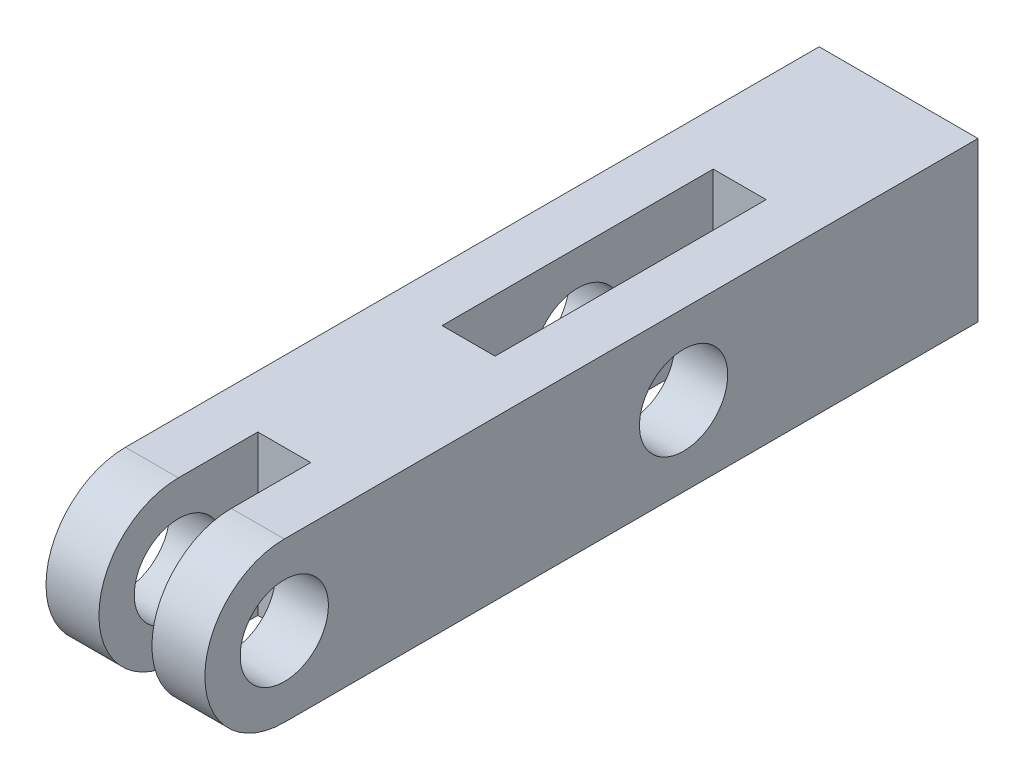
ISO-10303-21;
HEADER;
FILE_DESCRIPTION(('STEP AP214'),'2;1');
FILE_NAME('part.step','',(''),(''),'','','');
FILE_SCHEMA(('AUTOMOTIVE_DESIGN { 1 0 10303 214 1 1 1 1 }'));
ENDSEC;
DATA;
#1=APPLICATION_CONTEXT('core data for automotive mechanical design processes');
#2=APPLICATION_PROTOCOL_DEFINITION('international standard','automotive_design',2000,#1);
#3=PRODUCT_CONTEXT('',#1,'mechanical');
#4=PRODUCT('Part','Part','',(#3));
#5=PRODUCT_RELATED_PRODUCT_CATEGORY('part','',(#4));
#6=PRODUCT_DEFINITION_FORMATION('','',#4);
#7=PRODUCT_DEFINITION_CONTEXT('part definition',#1,'design');
#8=PRODUCT_DEFINITION('design','',#6,#7);
#9=PRODUCT_DEFINITION_SHAPE('','',#8);
#10=(LENGTH_UNIT() NAMED_UNIT(*) SI_UNIT(.MILLI.,.METRE.));
#11=(NAMED_UNIT(*) PLANE_ANGLE_UNIT() SI_UNIT($,.RADIAN.));
#12=(NAMED_UNIT(*) SI_UNIT($,.STERADIAN.) SOLID_ANGLE_UNIT());
#13=UNCERTAINTY_MEASURE_WITH_UNIT(LENGTH_MEASURE(1.E-05),#10,'distance_accuracy_value','');
#14=(GEOMETRIC_REPRESENTATION_CONTEXT(3) GLOBAL_UNCERTAINTY_ASSIGNED_CONTEXT((#13)) GLOBAL_UNIT_ASSIGNED_CONTEXT((#10,
#11,#12)) REPRESENTATION_CONTEXT('',''));
#15=CARTESIAN_POINT('',(0.,0.,0.));
#16=DIRECTION('',(0.,0.,1.));
#17=DIRECTION('',(1.,0.,0.));
#18=AXIS2_PLACEMENT_3D('',#15,#16,#17);
#19=CARTESIAN_POINT('',(3.,0.,9.));
#20=DIRECTION('',(1.,0.,0.));
#21=DIRECTION('',(0.,1.,0.));
#22=AXIS2_PLACEMENT_3D('',#19,#20,#21);
#23=PLANE('',#22);
#24=CARTESIAN_POINT('',(3.,4.5,4.5));
#25=DIRECTION('',(1.,0.,0.));
#26=DIRECTION('',(0.,1.,0.));
#27=AXIS2_PLACEMENT_3D('',#24,#25,#26);
#28=CIRCLE('',#27,2.5);
#29=CARTESIAN_POINT('',(3.,7.,4.5));
#30=VERTEX_POINT('',#29);
#31=EDGE_CURVE('E292',#30,#30,#28,.T.);
#32=ORIENTED_EDGE('',*,*,#31,.F.);
#33=EDGE_LOOP('',(#32));
#34=FACE_BOUND('',#33,.T.);
#35=CARTESIAN_POINT('',(3.,4.5,4.5));
#36=DIRECTION('',(1.,0.,0.));
#37=DIRECTION('',(0.,1.,0.));
#38=AXIS2_PLACEMENT_3D('',#35,#36,#37);
#39=CIRCLE('',#38,4.5);
#40=CARTESIAN_POINT('',(3.,9.,4.5));
#41=VERTEX_POINT('',#40);
#42=CARTESIAN_POINT('',(3.,0.,4.5));
#43=VERTEX_POINT('',#42);
#44=EDGE_CURVE('E208',#41,#43,#39,.T.);
#45=ORIENTED_EDGE('',*,*,#44,.T.);
#46=DIRECTION('',(0.,0.,-1.));
#47=VECTOR('',#46,1.);
#48=CARTESIAN_POINT('',(3.,0.,9.));
#49=LINE('',#48,#47);
#50=CARTESIAN_POINT('',(3.,0.,0.));
#51=VERTEX_POINT('',#50);
#52=EDGE_CURVE('E181',#43,#51,#49,.T.);
#53=ORIENTED_EDGE('',*,*,#52,.T.);
#54=DIRECTION('',(0.,-1.,0.));
#55=VECTOR('',#54,1.);
#56=CARTESIAN_POINT('',(3.,0.,0.));
#57=LINE('',#56,#55);
#58=CARTESIAN_POINT('',(3.,9.,0.));
#59=VERTEX_POINT('',#58);
#60=EDGE_CURVE('E190',#59,#51,#57,.T.);
#61=ORIENTED_EDGE('',*,*,#60,.F.);
#62=DIRECTION('',(0.,0.,-1.));
#63=VECTOR('',#62,1.);
#64=CARTESIAN_POINT('',(3.,9.,9.));
#65=LINE('',#64,#63);
#66=EDGE_CURVE('E12',#41,#59,#65,.T.);
#67=ORIENTED_EDGE('',*,*,#66,.F.);
#68=EDGE_LOOP('',(#45,#53,#61,#67));
#69=FACE_BOUND('',#68,.T.);
#70=ADVANCED_FACE('F75',(#34,#69),#23,.T.);
#71=CARTESIAN_POINT('',(0.,0.,9.));
#72=DIRECTION('',(-1.,0.,0.));
#73=DIRECTION('',(0.,-1.,0.));
#74=AXIS2_PLACEMENT_3D('',#71,#72,#73);
#75=PLANE('',#74);
#76=CARTESIAN_POINT('',(0.,4.5,4.5));
#77=DIRECTION('',(1.,0.,0.));
#78=DIRECTION('',(0.,0.,-1.));
#79=AXIS2_PLACEMENT_3D('',#76,#77,#78);
#80=CIRCLE('',#79,2.5);
#81=CARTESIAN_POINT('',(0.,4.5,2.));
#82=VERTEX_POINT('',#81);
#83=EDGE_CURVE('E299',#82,#82,#80,.T.);
#84=ORIENTED_EDGE('',*,*,#83,.T.);
#85=EDGE_LOOP('',(#84));
#86=FACE_BOUND('',#85,.T.);
#87=CARTESIAN_POINT('',(0.,4.5,-18.12));
#88=DIRECTION('',(1.,0.,0.));
#89=DIRECTION('',(0.,0.,-1.));
#90=AXIS2_PLACEMENT_3D('',#87,#88,#89);
#91=CIRCLE('',#90,2.5);
#92=CARTESIAN_POINT('',(0.,4.5,-20.62));
#93=VERTEX_POINT('',#92);
#94=EDGE_CURVE('E196',#93,#93,#91,.T.);
#95=ORIENTED_EDGE('',*,*,#94,.T.);
#96=EDGE_LOOP('',(#95));
#97=FACE_BOUND('',#96,.T.);
#98=DIRECTION('',(0.,0.,-1.));
#99=VECTOR('',#98,1.);
#100=CARTESIAN_POINT('',(0.,0.,9.));
#101=LINE('',#100,#99);
#102=CARTESIAN_POINT('',(0.,0.,4.5));
#103=VERTEX_POINT('',#102);
#104=CARTESIAN_POINT('',(0.,0.,-34.8));
#105=VERTEX_POINT('',#104);
#106=EDGE_CURVE('E178',#103,#105,#101,.T.);
#107=ORIENTED_EDGE('',*,*,#106,.F.);
#108=CARTESIAN_POINT('',(0.,4.5,4.5));
#109=DIRECTION('',(1.,0.,0.));
#110=DIRECTION('',(0.,0.,-1.));
#111=AXIS2_PLACEMENT_3D('',#108,#109,#110);
#112=CIRCLE('',#111,4.5);
#113=CARTESIAN_POINT('',(0.,9.,4.5));
#114=VERTEX_POINT('',#113);
#115=EDGE_CURVE('E162',#114,#103,#112,.T.);
#116=ORIENTED_EDGE('',*,*,#115,.F.);
#117=DIRECTION('',(0.,0.,-1.));
#118=VECTOR('',#117,1.);
#119=CARTESIAN_POINT('',(0.,9.,9.));
#120=LINE('',#119,#118);
#121=CARTESIAN_POINT('',(0.,9.,-34.8));
#122=VERTEX_POINT('',#121);
#123=EDGE_CURVE('E83',#114,#122,#120,.T.);
#124=ORIENTED_EDGE('',*,*,#123,.T.);
#125=DIRECTION('',(0.,1.,0.));
#126=VECTOR('',#125,1.);
#127=CARTESIAN_POINT('',(0.,9.,-34.8));
#128=LINE('',#127,#126);
#129=EDGE_CURVE('E187',#105,#122,#128,.T.);
#130=ORIENTED_EDGE('',*,*,#129,.F.);
#131=EDGE_LOOP('',(#107,#116,#124,#130));
#132=FACE_BOUND('',#131,.T.);
#133=ADVANCED_FACE('F185',(#86,#97,#132),#75,.T.);
#134=CARTESIAN_POINT('',(9.,9.,-10.44));
#135=DIRECTION('',(-1.,0.,0.));
#136=DIRECTION('',(0.,0.,1.));
#137=AXIS2_PLACEMENT_3D('',#134,#135,#136);
#138=PLANE('',#137);
#139=CARTESIAN_POINT('',(9.,4.5,4.5));
#140=DIRECTION('',(1.,0.,0.));
#141=DIRECTION('',(0.,0.,-1.));
#142=AXIS2_PLACEMENT_3D('',#139,#140,#141);
#143=CIRCLE('',#142,2.5);
#144=CARTESIAN_POINT('',(9.,4.5,2.));
#145=VERTEX_POINT('',#144);
#146=EDGE_CURVE('E296',#145,#145,#143,.T.);
#147=ORIENTED_EDGE('',*,*,#146,.F.);
#148=EDGE_LOOP('',(#147));
#149=FACE_BOUND('',#148,.T.);
#150=CARTESIAN_POINT('',(9.,4.5,-18.12));
#151=DIRECTION('',(1.,0.,0.));
#152=DIRECTION('',(0.,0.,-1.));
#153=AXIS2_PLACEMENT_3D('',#150,#151,#152);
#154=CIRCLE('',#153,2.5);
#155=CARTESIAN_POINT('',(9.,4.5,-20.62));
#156=VERTEX_POINT('',#155);
#157=EDGE_CURVE('E203',#156,#156,#154,.T.);
#158=ORIENTED_EDGE('',*,*,#157,.F.);
#159=EDGE_LOOP('',(#158));
#160=FACE_BOUND('',#159,.T.);
#161=CARTESIAN_POINT('',(9.,4.5,4.5));
#162=DIRECTION('',(1.,0.,0.));
#163=DIRECTION('',(0.,0.,-1.));
#164=AXIS2_PLACEMENT_3D('',#161,#162,#163);
#165=CIRCLE('',#164,4.5);
#166=CARTESIAN_POINT('',(9.,9.,4.5));
#167=VERTEX_POINT('',#166);
#168=CARTESIAN_POINT('',(9.,0.,4.5));
#169=VERTEX_POINT('',#168);
#170=EDGE_CURVE('E173',#167,#169,#165,.T.);
#171=ORIENTED_EDGE('',*,*,#170,.T.);
#172=DIRECTION('',(0.,0.,1.));
#173=VECTOR('',#172,1.);
#174=CARTESIAN_POINT('',(9.,0.,-10.44));
#175=LINE('',#174,#173);
#176=CARTESIAN_POINT('',(9.,0.,-34.8));
#177=VERTEX_POINT('',#176);
#178=EDGE_CURVE('E261',#177,#169,#175,.T.);
#179=ORIENTED_EDGE('',*,*,#178,.F.);
#180=DIRECTION('',(0.,-1.,0.));
#181=VECTOR('',#180,1.);
#182=CARTESIAN_POINT('',(9.,9.,-34.8));
#183=LINE('',#182,#181);
#184=CARTESIAN_POINT('',(9.,9.,-34.8));
#185=VERTEX_POINT('',#184);
#186=EDGE_CURVE('E213',#185,#177,#183,.T.);
#187=ORIENTED_EDGE('',*,*,#186,.F.);
#188=DIRECTION('',(0.,0.,1.));
#189=VECTOR('',#188,1.);
#190=CARTESIAN_POINT('',(9.,9.,-10.44));
#191=LINE('',#190,#189);
#192=EDGE_CURVE('E267',#185,#167,#191,.T.);
#193=ORIENTED_EDGE('',*,*,#192,.T.);
#194=EDGE_LOOP('',(#171,#179,#187,#193));
#195=FACE_BOUND('',#194,.T.);
#196=ADVANCED_FACE('F307',(#149,#160,#195),#138,.F.);
#197=CARTESIAN_POINT('',(6.,0.,9.));
#198=DIRECTION('',(1.,0.,0.));
#199=DIRECTION('',(0.,1.,0.));
#200=AXIS2_PLACEMENT_3D('',#197,#198,#199);
#201=PLANE('',#200);
#202=CARTESIAN_POINT('',(6.,4.5,4.5));
#203=DIRECTION('',(1.,0.,0.));
#204=DIRECTION('',(0.,1.,0.));
#205=AXIS2_PLACEMENT_3D('',#202,#203,#204);
#206=CIRCLE('',#205,2.5);
#207=CARTESIAN_POINT('',(6.,7.,4.5));
#208=VERTEX_POINT('',#207);
#209=EDGE_CURVE('E78',#208,#208,#206,.T.);
#210=ORIENTED_EDGE('',*,*,#209,.T.);
#211=EDGE_LOOP('',(#210));
#212=FACE_BOUND('',#211,.T.);
#213=DIRECTION('',(0.,0.,-1.));
#214=VECTOR('',#213,1.);
#215=CARTESIAN_POINT('',(6.,0.,9.));
#216=LINE('',#215,#214);
#217=CARTESIAN_POINT('',(6.,0.,4.5));
#218=VERTEX_POINT('',#217);
#219=CARTESIAN_POINT('',(6.,0.,0.));
#220=VERTEX_POINT('',#219);
#221=EDGE_CURVE('E252',#218,#220,#216,.T.);
#222=ORIENTED_EDGE('',*,*,#221,.F.);
#223=CARTESIAN_POINT('',(6.,4.5,4.5));
#224=DIRECTION('',(1.,0.,0.));
#225=DIRECTION('',(0.,1.,0.));
#226=AXIS2_PLACEMENT_3D('',#223,#224,#225);
#227=CIRCLE('',#226,4.5);
#228=CARTESIAN_POINT('',(6.,9.,4.5));
#229=VERTEX_POINT('',#228);
#230=EDGE_CURVE('E289',#229,#218,#227,.T.);
#231=ORIENTED_EDGE('',*,*,#230,.F.);
#232=DIRECTION('',(0.,0.,-1.));
#233=VECTOR('',#232,1.);
#234=CARTESIAN_POINT('',(6.,9.,9.));
#235=LINE('',#234,#233);
#236=CARTESIAN_POINT('',(6.,9.,0.));
#237=VERTEX_POINT('',#236);
#238=EDGE_CURVE('E254',#229,#237,#235,.T.);
#239=ORIENTED_EDGE('',*,*,#238,.T.);
#240=DIRECTION('',(0.,-1.,0.));
#241=VECTOR('',#240,1.);
#242=CARTESIAN_POINT('',(6.,0.,0.));
#243=LINE('',#242,#241);
#244=EDGE_CURVE('E249',#237,#220,#243,.T.);
#245=ORIENTED_EDGE('',*,*,#244,.T.);
#246=EDGE_LOOP('',(#222,#231,#239,#245));
#247=FACE_BOUND('',#246,.T.);
#248=ADVANCED_FACE('F283',(#212,#247),#201,.F.);
#249=CARTESIAN_POINT('',(0.,0.,9.));
#250=DIRECTION('',(0.,1.,0.));
#251=DIRECTION('',(0.,0.,1.));
#252=AXIS2_PLACEMENT_3D('',#249,#250,#251);
#253=PLANE('',#252);
#254=DIRECTION('',(0.,0.,1.));
#255=VECTOR('',#254,1.);
#256=CARTESIAN_POINT('',(6.,0.,-25.8));
#257=LINE('',#256,#255);
#258=CARTESIAN_POINT('',(6.,0.,-25.8));
#259=VERTEX_POINT('',#258);
#260=CARTESIAN_POINT('',(6.,0.,-10.44));
#261=VERTEX_POINT('',#260);
#262=EDGE_CURVE('E246',#259,#261,#257,.T.);
#263=ORIENTED_EDGE('',*,*,#262,.F.);
#264=DIRECTION('',(-1.,0.,0.));
#265=VECTOR('',#264,1.);
#266=CARTESIAN_POINT('',(9.,0.,-25.8));
#267=LINE('',#266,#265);
#268=CARTESIAN_POINT('',(3.,0.,-25.8));
#269=VERTEX_POINT('',#268);
#270=EDGE_CURVE('E200',#259,#269,#267,.T.);
#271=ORIENTED_EDGE('',*,*,#270,.T.);
#272=DIRECTION('',(0.,0.,1.));
#273=VECTOR('',#272,1.);
#274=CARTESIAN_POINT('',(3.,0.,-25.8));
#275=LINE('',#274,#273);
#276=CARTESIAN_POINT('',(3.,0.,-10.44));
#277=VERTEX_POINT('',#276);
#278=EDGE_CURVE('E230',#269,#277,#275,.T.);
#279=ORIENTED_EDGE('',*,*,#278,.T.);
#280=DIRECTION('',(-1.,0.,0.));
#281=VECTOR('',#280,1.);
#282=CARTESIAN_POINT('',(0.,0.,-10.44));
#283=LINE('',#282,#281);
#284=EDGE_CURVE('E96',#261,#277,#283,.T.);
#285=ORIENTED_EDGE('',*,*,#284,.F.);
#286=EDGE_LOOP('',(#263,#271,#279,#285));
#287=FACE_BOUND('',#286,.T.);
#288=DIRECTION('',(1.,0.,0.));
#289=VECTOR('',#288,1.);
#290=CARTESIAN_POINT('',(0.,0.,4.5));
#291=LINE('',#290,#289);
#292=EDGE_CURVE('E165',#103,#43,#291,.T.);
#293=ORIENTED_EDGE('',*,*,#292,.F.);
#294=ORIENTED_EDGE('',*,*,#106,.T.);
#295=DIRECTION('',(-1.,0.,0.));
#296=VECTOR('',#295,1.);
#297=CARTESIAN_POINT('',(9.,0.,-34.8));
#298=LINE('',#297,#296);
#299=EDGE_CURVE('E216',#177,#105,#298,.T.);
#300=ORIENTED_EDGE('',*,*,#299,.F.);
#301=ORIENTED_EDGE('',*,*,#178,.T.);
#302=EDGE_CURVE('E182',#218,#169,#291,.T.);
#303=ORIENTED_EDGE('',*,*,#302,.F.);
#304=ORIENTED_EDGE('',*,*,#221,.T.);
#305=DIRECTION('',(-1.,0.,0.));
#306=VECTOR('',#305,1.);
#307=CARTESIAN_POINT('',(0.,0.,0.));
#308=LINE('',#307,#306);
#309=EDGE_CURVE('E259',#220,#51,#308,.T.);
#310=ORIENTED_EDGE('',*,*,#309,.T.);
#311=ORIENTED_EDGE('',*,*,#52,.F.);
#312=EDGE_LOOP('',(#293,#294,#300,#301,#303,#304,#310,#311));
#313=FACE_BOUND('',#312,.T.);
#314=ADVANCED_FACE('F176',(#287,#313),#253,.F.);
#315=CARTESIAN_POINT('',(0.,9.,9.));
#316=DIRECTION('',(0.,1.,0.));
#317=DIRECTION('',(0.,0.,1.));
#318=AXIS2_PLACEMENT_3D('',#315,#316,#317);
#319=PLANE('',#318);
#320=DIRECTION('',(1.,0.,0.));
#321=VECTOR('',#320,1.);
#322=CARTESIAN_POINT('',(9.,9.,-25.8));
#323=LINE('',#322,#321);
#324=CARTESIAN_POINT('',(3.,9.,-25.8));
#325=VERTEX_POINT('',#324);
#326=CARTESIAN_POINT('',(6.,9.,-25.8));
#327=VERTEX_POINT('',#326);
#328=EDGE_CURVE('E217',#325,#327,#323,.T.);
#329=ORIENTED_EDGE('',*,*,#328,.T.);
#330=DIRECTION('',(0.,0.,1.));
#331=VECTOR('',#330,1.);
#332=CARTESIAN_POINT('',(6.,9.,-25.8));
#333=LINE('',#332,#331);
#334=CARTESIAN_POINT('',(6.,9.,-10.44));
#335=VERTEX_POINT('',#334);
#336=EDGE_CURVE('E241',#327,#335,#333,.T.);
#337=ORIENTED_EDGE('',*,*,#336,.T.);
#338=DIRECTION('',(1.,0.,0.));
#339=VECTOR('',#338,1.);
#340=CARTESIAN_POINT('',(0.,9.,-10.44));
#341=LINE('',#340,#339);
#342=CARTESIAN_POINT('',(3.,9.,-10.44));
#343=VERTEX_POINT('',#342);
#344=EDGE_CURVE('E257',#343,#335,#341,.T.);
#345=ORIENTED_EDGE('',*,*,#344,.F.);
#346=DIRECTION('',(0.,0.,1.));
#347=VECTOR('',#346,1.);
#348=CARTESIAN_POINT('',(3.,9.,-25.8));
#349=LINE('',#348,#347);
#350=EDGE_CURVE('E234',#325,#343,#349,.T.);
#351=ORIENTED_EDGE('',*,*,#350,.F.);
#352=EDGE_LOOP('',(#329,#337,#345,#351));
#353=FACE_BOUND('',#352,.T.);
#354=ORIENTED_EDGE('',*,*,#123,.F.);
#355=DIRECTION('',(1.,0.,0.));
#356=VECTOR('',#355,1.);
#357=CARTESIAN_POINT('',(0.,9.,4.5));
#358=LINE('',#357,#356);
#359=EDGE_CURVE('E168',#114,#41,#358,.T.);
#360=ORIENTED_EDGE('',*,*,#359,.T.);
#361=ORIENTED_EDGE('',*,*,#66,.T.);
#362=DIRECTION('',(1.,0.,0.));
#363=VECTOR('',#362,1.);
#364=CARTESIAN_POINT('',(0.,9.,0.));
#365=LINE('',#364,#363);
#366=EDGE_CURVE('E256',#59,#237,#365,.T.);
#367=ORIENTED_EDGE('',*,*,#366,.T.);
#368=ORIENTED_EDGE('',*,*,#238,.F.);
#369=EDGE_CURVE('E172',#229,#167,#358,.T.);
#370=ORIENTED_EDGE('',*,*,#369,.T.);
#371=ORIENTED_EDGE('',*,*,#192,.F.);
#372=DIRECTION('',(1.,0.,0.));
#373=VECTOR('',#372,1.);
#374=CARTESIAN_POINT('',(9.,9.,-34.8));
#375=LINE('',#374,#373);
#376=EDGE_CURVE('E220',#122,#185,#375,.T.);
#377=ORIENTED_EDGE('',*,*,#376,.F.);
#378=EDGE_LOOP('',(#354,#360,#361,#367,#368,#370,#371,#377));
#379=FACE_BOUND('',#378,.T.);
#380=ADVANCED_FACE('F286',(#353,#379),#319,.T.);
#381=CARTESIAN_POINT('',(0.,0.,-10.44));
#382=DIRECTION('',(0.,0.,1.));
#383=DIRECTION('',(1.,0.,0.));
#384=AXIS2_PLACEMENT_3D('',#381,#382,#383);
#385=PLANE('',#384);
#386=DIRECTION('',(0.,-1.,0.));
#387=VECTOR('',#386,1.);
#388=CARTESIAN_POINT('',(3.,9.,-10.44));
#389=LINE('',#388,#387);
#390=EDGE_CURVE('E91',#343,#277,#389,.T.);
#391=ORIENTED_EDGE('',*,*,#390,.F.);
#392=ORIENTED_EDGE('',*,*,#344,.T.);
#393=DIRECTION('',(0.,1.,0.));
#394=VECTOR('',#393,1.);
#395=CARTESIAN_POINT('',(6.,9.,-10.44));
#396=LINE('',#395,#394);
#397=EDGE_CURVE('E237',#261,#335,#396,.T.);
#398=ORIENTED_EDGE('',*,*,#397,.F.);
#399=ORIENTED_EDGE('',*,*,#284,.T.);
#400=EDGE_LOOP('',(#391,#392,#398,#399));
#401=FACE_BOUND('',#400,.T.);
#402=ADVANCED_FACE('F371',(#401),#385,.F.);
#403=CARTESIAN_POINT('',(0.,0.,0.));
#404=DIRECTION('',(0.,0.,1.));
#405=DIRECTION('',(1.,0.,0.));
#406=AXIS2_PLACEMENT_3D('',#403,#404,#405);
#407=PLANE('',#406);
#408=ORIENTED_EDGE('',*,*,#309,.F.);
#409=ORIENTED_EDGE('',*,*,#244,.F.);
#410=ORIENTED_EDGE('',*,*,#366,.F.);
#411=ORIENTED_EDGE('',*,*,#60,.T.);
#412=EDGE_LOOP('',(#408,#409,#410,#411));
#413=FACE_BOUND('',#412,.T.);
#414=ADVANCED_FACE('F274',(#413),#407,.T.);
#415=CARTESIAN_POINT('',(6.,9.,-25.8));
#416=DIRECTION('',(1.,0.,0.));
#417=DIRECTION('',(0.,1.,0.));
#418=AXIS2_PLACEMENT_3D('',#415,#416,#417);
#419=PLANE('',#418);
#420=CARTESIAN_POINT('',(6.,4.5,-18.12));
#421=DIRECTION('',(1.,0.,0.));
#422=DIRECTION('',(0.,1.,0.));
#423=AXIS2_PLACEMENT_3D('',#420,#421,#422);
#424=CIRCLE('',#423,2.5);
#425=CARTESIAN_POINT('',(6.,7.,-18.12));
#426=VERTEX_POINT('',#425);
#427=EDGE_CURVE('E195',#426,#426,#424,.T.);
#428=ORIENTED_EDGE('',*,*,#427,.T.);
#429=EDGE_LOOP('',(#428));
#430=FACE_BOUND('',#429,.T.);
#431=ORIENTED_EDGE('',*,*,#397,.T.);
#432=ORIENTED_EDGE('',*,*,#336,.F.);
#433=DIRECTION('',(0.,1.,0.));
#434=VECTOR('',#433,1.);
#435=CARTESIAN_POINT('',(6.,9.,-25.8));
#436=LINE('',#435,#434);
#437=EDGE_CURVE('E238',#259,#327,#436,.T.);
#438=ORIENTED_EDGE('',*,*,#437,.F.);
#439=ORIENTED_EDGE('',*,*,#262,.T.);
#440=EDGE_LOOP('',(#431,#432,#438,#439));
#441=FACE_BOUND('',#440,.T.);
#442=ADVANCED_FACE('F352',(#430,#441),#419,.F.);
#443=CARTESIAN_POINT('',(3.,9.,-25.8));
#444=DIRECTION('',(-1.,0.,0.));
#445=DIRECTION('',(0.,-1.,0.));
#446=AXIS2_PLACEMENT_3D('',#443,#444,#445);
#447=PLANE('',#446);
#448=CARTESIAN_POINT('',(3.,4.5,-18.12));
#449=DIRECTION('',(-1.,0.,0.));
#450=DIRECTION('',(0.,-1.,0.));
#451=AXIS2_PLACEMENT_3D('',#448,#449,#450);
#452=CIRCLE('',#451,2.5);
#453=CARTESIAN_POINT('',(3.,2.,-18.12));
#454=VERTEX_POINT('',#453);
#455=EDGE_CURVE('E193',#454,#454,#452,.T.);
#456=ORIENTED_EDGE('',*,*,#455,.T.);
#457=EDGE_LOOP('',(#456));
#458=FACE_BOUND('',#457,.T.);
#459=ORIENTED_EDGE('',*,*,#390,.T.);
#460=ORIENTED_EDGE('',*,*,#278,.F.);
#461=DIRECTION('',(0.,-1.,0.));
#462=VECTOR('',#461,1.);
#463=CARTESIAN_POINT('',(3.,9.,-25.8));
#464=LINE('',#463,#462);
#465=EDGE_CURVE('E227',#325,#269,#464,.T.);
#466=ORIENTED_EDGE('',*,*,#465,.F.);
#467=ORIENTED_EDGE('',*,*,#350,.T.);
#468=EDGE_LOOP('',(#459,#460,#466,#467));
#469=FACE_BOUND('',#468,.T.);
#470=ADVANCED_FACE('F321',(#458,#469),#447,.F.);
#471=CARTESIAN_POINT('',(0.,0.,-25.8));
#472=DIRECTION('',(0.,0.,-1.));
#473=DIRECTION('',(-1.,0.,0.));
#474=AXIS2_PLACEMENT_3D('',#471,#472,#473);
#475=PLANE('',#474);
#476=ORIENTED_EDGE('',*,*,#270,.F.);
#477=ORIENTED_EDGE('',*,*,#437,.T.);
#478=ORIENTED_EDGE('',*,*,#328,.F.);
#479=ORIENTED_EDGE('',*,*,#465,.T.);
#480=EDGE_LOOP('',(#476,#477,#478,#479));
#481=FACE_BOUND('',#480,.T.);
#482=ADVANCED_FACE('F312',(#481),#475,.F.);
#483=CARTESIAN_POINT('',(0.,0.,-34.8));
#484=DIRECTION('',(0.,0.,-1.));
#485=DIRECTION('',(-1.,0.,0.));
#486=AXIS2_PLACEMENT_3D('',#483,#484,#485);
#487=PLANE('',#486);
#488=ORIENTED_EDGE('',*,*,#186,.T.);
#489=ORIENTED_EDGE('',*,*,#299,.T.);
#490=ORIENTED_EDGE('',*,*,#129,.T.);
#491=ORIENTED_EDGE('',*,*,#376,.T.);
#492=EDGE_LOOP('',(#488,#489,#490,#491));
#493=FACE_BOUND('',#492,.T.);
#494=ADVANCED_FACE('F309',(#493),#487,.T.);
#495=CARTESIAN_POINT('',(0.,4.5,-18.12));
#496=DIRECTION('',(1.,0.,0.));
#497=DIRECTION('',(0.,0.,-1.));
#498=AXIS2_PLACEMENT_3D('',#495,#496,#497);
#499=CYLINDRICAL_SURFACE('',#498,2.5);
#500=ORIENTED_EDGE('',*,*,#94,.F.);
#501=EDGE_LOOP('',(#500));
#502=FACE_BOUND('',#501,.T.);
#503=ORIENTED_EDGE('',*,*,#455,.F.);
#504=EDGE_LOOP('',(#503));
#505=FACE_BOUND('',#504,.T.);
#506=ADVANCED_FACE('F311',(#502,#505),#499,.F.);
#507=ORIENTED_EDGE('',*,*,#157,.T.);
#508=EDGE_LOOP('',(#507));
#509=FACE_BOUND('',#508,.T.);
#510=ORIENTED_EDGE('',*,*,#427,.F.);
#511=EDGE_LOOP('',(#510));
#512=FACE_BOUND('',#511,.T.);
#513=ADVANCED_FACE('F318',(#509,#512),#499,.F.);
#514=CARTESIAN_POINT('',(0.,4.5,4.5));
#515=DIRECTION('',(1.,0.,0.));
#516=DIRECTION('',(0.,0.,-1.));
#517=AXIS2_PLACEMENT_3D('',#514,#515,#516);
#518=CYLINDRICAL_SURFACE('',#517,4.5);
#519=ORIENTED_EDGE('',*,*,#230,.T.);
#520=ORIENTED_EDGE('',*,*,#302,.T.);
#521=ORIENTED_EDGE('',*,*,#170,.F.);
#522=ORIENTED_EDGE('',*,*,#369,.F.);
#523=EDGE_LOOP('',(#519,#520,#521,#522));
#524=FACE_BOUND('',#523,.T.);
#525=ADVANCED_FACE('F304',(#524),#518,.T.);
#526=ORIENTED_EDGE('',*,*,#359,.F.);
#527=ORIENTED_EDGE('',*,*,#115,.T.);
#528=ORIENTED_EDGE('',*,*,#292,.T.);
#529=ORIENTED_EDGE('',*,*,#44,.F.);
#530=EDGE_LOOP('',(#526,#527,#528,#529));
#531=FACE_BOUND('',#530,.T.);
#532=ADVANCED_FACE('F164',(#531),#518,.T.);
#533=CARTESIAN_POINT('',(0.,4.5,4.5));
#534=DIRECTION('',(1.,0.,0.));
#535=DIRECTION('',(0.,0.,-1.));
#536=AXIS2_PLACEMENT_3D('',#533,#534,#535);
#537=CYLINDRICAL_SURFACE('',#536,2.5);
#538=ORIENTED_EDGE('',*,*,#146,.T.);
#539=EDGE_LOOP('',(#538));
#540=FACE_BOUND('',#539,.T.);
#541=ORIENTED_EDGE('',*,*,#209,.F.);
#542=EDGE_LOOP('',(#541));
#543=FACE_BOUND('',#542,.T.);
#544=ADVANCED_FACE('F335',(#540,#543),#537,.F.);
#545=ORIENTED_EDGE('',*,*,#31,.T.);
#546=EDGE_LOOP('',(#545));
#547=FACE_BOUND('',#546,.T.);
#548=ORIENTED_EDGE('',*,*,#83,.F.);
#549=EDGE_LOOP('',(#548));
#550=FACE_BOUND('',#549,.T.);
#551=ADVANCED_FACE('F332',(#547,#550),#537,.F.);
#552=CLOSED_SHELL('',(#70,#133,#196,#248,#314,#380,#402,#414,#442,#470,#482,#494,#506,#513,#525,
#532,#544,#551));
#553=MANIFOLD_SOLID_BREP('B2',#552);
#554=ADVANCED_BREP_SHAPE_REPRESENTATION('',(#18,#553),#14);
#555=SHAPE_DEFINITION_REPRESENTATION(#9,#554);
ENDSEC;
END-ISO-10303-21;
